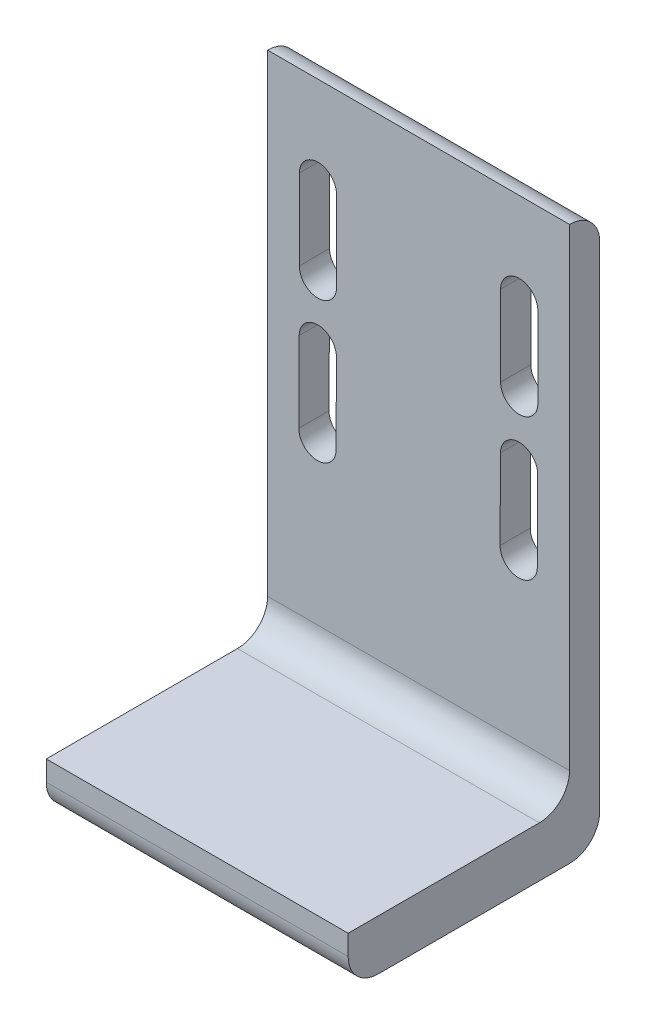
ISO-10303-21;
HEADER;
FILE_DESCRIPTION(('STEP AP214'),'2;1');
FILE_NAME('part.step','',(''),(''),'','','');
FILE_SCHEMA(('AUTOMOTIVE_DESIGN { 1 0 10303 214 1 1 1 1 }'));
ENDSEC;
DATA;
#1=APPLICATION_CONTEXT('core data for automotive mechanical design processes');
#2=APPLICATION_PROTOCOL_DEFINITION('international standard','automotive_design',2000,#1);
#3=PRODUCT_CONTEXT('',#1,'mechanical');
#4=PRODUCT('Part','Part','',(#3));
#5=PRODUCT_RELATED_PRODUCT_CATEGORY('part','',(#4));
#6=PRODUCT_DEFINITION_FORMATION('','',#4);
#7=PRODUCT_DEFINITION_CONTEXT('part definition',#1,'design');
#8=PRODUCT_DEFINITION('design','',#6,#7);
#9=PRODUCT_DEFINITION_SHAPE('','',#8);
#10=(LENGTH_UNIT() NAMED_UNIT(*) SI_UNIT(.MILLI.,.METRE.));
#11=(NAMED_UNIT(*) PLANE_ANGLE_UNIT() SI_UNIT($,.RADIAN.));
#12=(NAMED_UNIT(*) SI_UNIT($,.STERADIAN.) SOLID_ANGLE_UNIT());
#13=UNCERTAINTY_MEASURE_WITH_UNIT(LENGTH_MEASURE(1.E-05),#10,'distance_accuracy_value','');
#14=(GEOMETRIC_REPRESENTATION_CONTEXT(3) GLOBAL_UNCERTAINTY_ASSIGNED_CONTEXT((#13)) GLOBAL_UNIT_ASSIGNED_CONTEXT((#10,
#11,#12)) REPRESENTATION_CONTEXT('',''));
#15=CARTESIAN_POINT('',(0.,0.,0.));
#16=DIRECTION('',(0.,0.,1.));
#17=DIRECTION('',(1.,0.,0.));
#18=AXIS2_PLACEMENT_3D('',#15,#16,#17);
#19=CARTESIAN_POINT('',(0.,0.,3.));
#20=DIRECTION('',(0.,0.,-1.));
#21=DIRECTION('',(-1.,0.,0.));
#22=AXIS2_PLACEMENT_3D('',#19,#20,#21);
#23=PLANE('',#22);
#24=CARTESIAN_POINT('',(9.98523903623765,1.90319185863169,3.));
#25=DIRECTION('',(0.,0.,1.));
#26=DIRECTION('',(1.,0.,0.));
#27=AXIS2_PLACEMENT_3D('',#24,#25,#26);
#28=CIRCLE('',#27,1.85);
#29=CARTESIAN_POINT('',(11.8352173480357,1.89423385232464,3.));
#30=VERTEX_POINT('',#29);
#31=CARTESIAN_POINT('',(8.13526072443966,1.91214986493877,3.));
#32=VERTEX_POINT('',#31);
#33=EDGE_CURVE('E266',#30,#32,#28,.T.);
#34=ORIENTED_EDGE('',*,*,#33,.F.);
#35=DIRECTION('',(0.00484216557138159,0.999988276647571,0.));
#36=VECTOR('',#35,1.);
#37=CARTESIAN_POINT('',(11.8352173480357,1.89423385232464,3.));
#38=LINE('',#37,#36);
#39=CARTESIAN_POINT('',(11.7964800234646,-6.10567236085594,3.));
#40=VERTEX_POINT('',#39);
#41=EDGE_CURVE('E274',#40,#30,#38,.T.);
#42=ORIENTED_EDGE('',*,*,#41,.F.);
#43=CARTESIAN_POINT('',(9.9465017116666,-6.09671435454889,3.));
#44=DIRECTION('',(0.,0.,1.));
#45=DIRECTION('',(1.,0.,0.));
#46=AXIS2_PLACEMENT_3D('',#43,#44,#45);
#47=CIRCLE('',#46,1.85);
#48=CARTESIAN_POINT('',(8.09652339986859,-6.08775634824183,3.));
#49=VERTEX_POINT('',#48);
#50=EDGE_CURVE('E271',#49,#40,#47,.T.);
#51=ORIENTED_EDGE('',*,*,#50,.F.);
#52=DIRECTION('',(-0.00484216557138158,-0.999988276647571,0.));
#53=VECTOR('',#52,1.);
#54=CARTESIAN_POINT('',(8.13526072443966,1.91214986493877,3.));
#55=LINE('',#54,#53);
#56=EDGE_CURVE('E268',#32,#49,#55,.T.);
#57=ORIENTED_EDGE('',*,*,#56,.F.);
#58=EDGE_LOOP('',(#34,#42,#51,#57));
#59=FACE_BOUND('',#58,.T.);
#60=CARTESIAN_POINT('',(-10.0000000000004,8.00000000000205,3.));
#61=DIRECTION('',(0.,0.,1.));
#62=DIRECTION('',(1.,0.,0.));
#63=AXIS2_PLACEMENT_3D('',#60,#61,#62);
#64=CIRCLE('',#63,1.85);
#65=CARTESIAN_POINT('',(-11.8500000000004,8.00000000000205,3.));
#66=VERTEX_POINT('',#65);
#67=CARTESIAN_POINT('',(-8.15000000000039,8.00000000000204,3.));
#68=VERTEX_POINT('',#67);
#69=EDGE_CURVE('E328',#66,#68,#64,.T.);
#70=ORIENTED_EDGE('',*,*,#69,.F.);
#71=DIRECTION('',(0.,-1.,0.));
#72=VECTOR('',#71,1.);
#73=CARTESIAN_POINT('',(-11.8500000000004,8.00000000000205,3.));
#74=LINE('',#73,#72);
#75=CARTESIAN_POINT('',(-11.8500000000004,16.0000000000021,3.));
#76=VERTEX_POINT('',#75);
#77=EDGE_CURVE('E336',#76,#66,#74,.T.);
#78=ORIENTED_EDGE('',*,*,#77,.F.);
#79=CARTESIAN_POINT('',(-10.0000000000004,16.0000000000021,3.));
#80=DIRECTION('',(0.,0.,1.));
#81=DIRECTION('',(1.,0.,0.));
#82=AXIS2_PLACEMENT_3D('',#79,#80,#81);
#83=CIRCLE('',#82,1.85);
#84=CARTESIAN_POINT('',(-8.1500000000004,16.0000000000021,3.));
#85=VERTEX_POINT('',#84);
#86=EDGE_CURVE('E333',#85,#76,#83,.T.);
#87=ORIENTED_EDGE('',*,*,#86,.F.);
#88=DIRECTION('',(0.,1.,0.));
#89=VECTOR('',#88,1.);
#90=CARTESIAN_POINT('',(-8.15000000000039,8.00000000000204,3.));
#91=LINE('',#90,#89);
#92=EDGE_CURVE('E330',#68,#85,#91,.T.);
#93=ORIENTED_EDGE('',*,*,#92,.F.);
#94=EDGE_LOOP('',(#70,#78,#87,#93));
#95=FACE_BOUND('',#94,.T.);
#96=DIRECTION('',(0.,-1.,0.));
#97=VECTOR('',#96,1.);
#98=CARTESIAN_POINT('',(-15.,-25.,3.));
#99=LINE('',#98,#97);
#100=CARTESIAN_POINT('',(-15.,25.,3.));
#101=VERTEX_POINT('',#100);
#102=CARTESIAN_POINT('',(-15.,-22.,3.));
#103=VERTEX_POINT('',#102);
#104=EDGE_CURVE('E366',#101,#103,#99,.T.);
#105=ORIENTED_EDGE('',*,*,#104,.T.);
#106=DIRECTION('',(1.,0.,0.));
#107=VECTOR('',#106,1.);
#108=CARTESIAN_POINT('',(15.,-22.,3.));
#109=LINE('',#108,#107);
#110=CARTESIAN_POINT('',(15.,-22.,3.));
#111=VERTEX_POINT('',#110);
#112=EDGE_CURVE('E386',#103,#111,#109,.T.);
#113=ORIENTED_EDGE('',*,*,#112,.T.);
#114=DIRECTION('',(0.,1.,0.));
#115=VECTOR('',#114,1.);
#116=CARTESIAN_POINT('',(15.,-25.,3.));
#117=LINE('',#116,#115);
#118=CARTESIAN_POINT('',(15.,25.,3.));
#119=VERTEX_POINT('',#118);
#120=EDGE_CURVE('E359',#111,#119,#117,.T.);
#121=ORIENTED_EDGE('',*,*,#120,.T.);
#122=DIRECTION('',(-1.,0.,0.));
#123=VECTOR('',#122,1.);
#124=CARTESIAN_POINT('',(-15.,25.,3.));
#125=LINE('',#124,#123);
#126=EDGE_CURVE('E362',#119,#101,#125,.T.);
#127=ORIENTED_EDGE('',*,*,#126,.T.);
#128=EDGE_LOOP('',(#105,#113,#121,#127));
#129=FACE_BOUND('',#128,.T.);
#130=CARTESIAN_POINT('',(10.0000000000004,8.00000000000206,3.));
#131=DIRECTION('',(0.,0.,1.));
#132=DIRECTION('',(-1.,0.,0.));
#133=AXIS2_PLACEMENT_3D('',#130,#131,#132);
#134=CIRCLE('',#133,1.85);
#135=CARTESIAN_POINT('',(8.15000000000039,8.00000000000204,3.));
#136=VERTEX_POINT('',#135);
#137=CARTESIAN_POINT('',(11.8500000000004,8.00000000000205,3.));
#138=VERTEX_POINT('',#137);
#139=EDGE_CURVE('E297',#136,#138,#134,.T.);
#140=ORIENTED_EDGE('',*,*,#139,.F.);
#141=DIRECTION('',(0.,-1.,0.));
#142=VECTOR('',#141,1.);
#143=CARTESIAN_POINT('',(8.15000000000039,8.00000000000204,3.));
#144=LINE('',#143,#142);
#145=CARTESIAN_POINT('',(8.15000000000039,16.0000000000021,3.));
#146=VERTEX_POINT('',#145);
#147=EDGE_CURVE('E305',#146,#136,#144,.T.);
#148=ORIENTED_EDGE('',*,*,#147,.F.);
#149=CARTESIAN_POINT('',(10.0000000000004,16.0000000000021,3.));
#150=DIRECTION('',(0.,0.,1.));
#151=DIRECTION('',(-1.,0.,0.));
#152=AXIS2_PLACEMENT_3D('',#149,#150,#151);
#153=CIRCLE('',#152,1.85);
#154=CARTESIAN_POINT('',(11.8500000000004,16.0000000000021,3.));
#155=VERTEX_POINT('',#154);
#156=EDGE_CURVE('E302',#155,#146,#153,.T.);
#157=ORIENTED_EDGE('',*,*,#156,.F.);
#158=DIRECTION('',(0.,1.,0.));
#159=VECTOR('',#158,1.);
#160=CARTESIAN_POINT('',(11.8500000000004,8.00000000000205,3.));
#161=LINE('',#160,#159);
#162=EDGE_CURVE('E299',#138,#155,#161,.T.);
#163=ORIENTED_EDGE('',*,*,#162,.F.);
#164=EDGE_LOOP('',(#140,#148,#157,#163));
#165=FACE_BOUND('',#164,.T.);
#166=CARTESIAN_POINT('',(-10.0145264967145,2.00003517005933,3.));
#167=DIRECTION('',(0.,0.,1.));
#168=DIRECTION('',(-1.,0.,0.));
#169=AXIS2_PLACEMENT_3D('',#166,#167,#168);
#170=CIRCLE('',#169,1.85);
#171=CARTESIAN_POINT('',(-8.16454818491653,1.99107716375229,3.));
#172=VERTEX_POINT('',#171);
#173=CARTESIAN_POINT('',(-11.8645048085125,2.00899317636639,3.));
#174=VERTEX_POINT('',#173);
#175=EDGE_CURVE('E235',#172,#174,#170,.T.);
#176=ORIENTED_EDGE('',*,*,#175,.F.);
#177=DIRECTION('',(0.00484216557138158,0.999988276647571,0.));
#178=VECTOR('',#177,1.);
#179=CARTESIAN_POINT('',(-8.16454818491653,1.99107716375229,3.));
#180=LINE('',#179,#178);
#181=CARTESIAN_POINT('',(-8.20328550948758,-6.00882904942831,3.));
#182=VERTEX_POINT('',#181);
#183=EDGE_CURVE('E243',#182,#172,#180,.T.);
#184=ORIENTED_EDGE('',*,*,#183,.F.);
#185=CARTESIAN_POINT('',(-10.0532638212856,-5.99987104312124,3.));
#186=DIRECTION('',(0.,0.,1.));
#187=DIRECTION('',(-1.,0.,0.));
#188=AXIS2_PLACEMENT_3D('',#185,#186,#187);
#189=CIRCLE('',#188,1.85);
#190=CARTESIAN_POINT('',(-11.9032421330836,-5.99091303681418,3.));
#191=VERTEX_POINT('',#190);
#192=EDGE_CURVE('E240',#191,#182,#189,.T.);
#193=ORIENTED_EDGE('',*,*,#192,.F.);
#194=DIRECTION('',(-0.00484216557138139,-0.999988276647571,0.));
#195=VECTOR('',#194,1.);
#196=CARTESIAN_POINT('',(-11.8645048085125,2.00899317636639,3.));
#197=LINE('',#196,#195);
#198=EDGE_CURVE('E237',#174,#191,#197,.T.);
#199=ORIENTED_EDGE('',*,*,#198,.F.);
#200=EDGE_LOOP('',(#176,#184,#193,#199));
#201=FACE_BOUND('',#200,.T.);
#202=ADVANCED_FACE('F35',(#59,#95,#129,#165,#201),#23,.F.);
#203=CARTESIAN_POINT('',(0.,0.,0.));
#204=DIRECTION('',(0.,0.,-1.));
#205=DIRECTION('',(-1.,0.,0.));
#206=AXIS2_PLACEMENT_3D('',#203,#204,#205);
#207=PLANE('',#206);
#208=DIRECTION('',(0.,-1.,0.));
#209=VECTOR('',#208,1.);
#210=CARTESIAN_POINT('',(-15.,-25.,0.));
#211=LINE('',#210,#209);
#212=CARTESIAN_POINT('',(-15.,22.,0.));
#213=VERTEX_POINT('',#212);
#214=CARTESIAN_POINT('',(-15.,-27.,0.));
#215=VERTEX_POINT('',#214);
#216=EDGE_CURVE('E363',#213,#215,#211,.T.);
#217=ORIENTED_EDGE('',*,*,#216,.F.);
#218=DIRECTION('',(-1.,0.,0.));
#219=VECTOR('',#218,1.);
#220=CARTESIAN_POINT('',(15.,22.,0.));
#221=LINE('',#220,#219);
#222=CARTESIAN_POINT('',(15.,22.,0.));
#223=VERTEX_POINT('',#222);
#224=EDGE_CURVE('E380',#213,#223,#221,.F.);
#225=ORIENTED_EDGE('',*,*,#224,.T.);
#226=DIRECTION('',(0.,1.,0.));
#227=VECTOR('',#226,1.);
#228=CARTESIAN_POINT('',(15.,-25.,0.));
#229=LINE('',#228,#227);
#230=CARTESIAN_POINT('',(15.,-27.,0.));
#231=VERTEX_POINT('',#230);
#232=EDGE_CURVE('E358',#231,#223,#229,.T.);
#233=ORIENTED_EDGE('',*,*,#232,.F.);
#234=DIRECTION('',(1.,0.,0.));
#235=VECTOR('',#234,1.);
#236=CARTESIAN_POINT('',(-15.,-27.,0.));
#237=LINE('',#236,#235);
#238=EDGE_CURVE('E378',#231,#215,#237,.F.);
#239=ORIENTED_EDGE('',*,*,#238,.T.);
#240=EDGE_LOOP('',(#217,#225,#233,#239));
#241=FACE_BOUND('',#240,.T.);
#242=DIRECTION('',(0.,-1.,0.));
#243=VECTOR('',#242,1.);
#244=CARTESIAN_POINT('',(-11.8500000000004,8.00000000000205,0.));
#245=LINE('',#244,#243);
#246=CARTESIAN_POINT('',(-11.8500000000004,16.0000000000021,0.));
#247=VERTEX_POINT('',#246);
#248=CARTESIAN_POINT('',(-11.8500000000004,8.00000000000205,0.));
#249=VERTEX_POINT('',#248);
#250=EDGE_CURVE('E331',#247,#249,#245,.T.);
#251=ORIENTED_EDGE('',*,*,#250,.T.);
#252=CARTESIAN_POINT('',(-10.0000000000004,8.00000000000205,0.));
#253=DIRECTION('',(0.,0.,1.));
#254=DIRECTION('',(1.,0.,0.));
#255=AXIS2_PLACEMENT_3D('',#252,#253,#254);
#256=CIRCLE('',#255,1.85);
#257=CARTESIAN_POINT('',(-8.15000000000039,8.00000000000204,0.));
#258=VERTEX_POINT('',#257);
#259=EDGE_CURVE('E327',#249,#258,#256,.T.);
#260=ORIENTED_EDGE('',*,*,#259,.T.);
#261=DIRECTION('',(0.,1.,0.));
#262=VECTOR('',#261,1.);
#263=CARTESIAN_POINT('',(-8.15000000000039,8.00000000000204,0.));
#264=LINE('',#263,#262);
#265=CARTESIAN_POINT('',(-8.1500000000004,16.0000000000021,0.));
#266=VERTEX_POINT('',#265);
#267=EDGE_CURVE('E341',#258,#266,#264,.T.);
#268=ORIENTED_EDGE('',*,*,#267,.T.);
#269=CARTESIAN_POINT('',(-10.0000000000004,16.0000000000021,0.));
#270=DIRECTION('',(0.,0.,1.));
#271=DIRECTION('',(1.,0.,0.));
#272=AXIS2_PLACEMENT_3D('',#269,#270,#271);
#273=CIRCLE('',#272,1.85);
#274=EDGE_CURVE('E344',#266,#247,#273,.T.);
#275=ORIENTED_EDGE('',*,*,#274,.T.);
#276=EDGE_LOOP('',(#251,#260,#268,#275));
#277=FACE_BOUND('',#276,.T.);
#278=DIRECTION('',(0.,-1.,0.));
#279=VECTOR('',#278,1.);
#280=CARTESIAN_POINT('',(8.15000000000039,8.00000000000204,0.));
#281=LINE('',#280,#279);
#282=CARTESIAN_POINT('',(8.15000000000037,16.0000000000021,0.));
#283=VERTEX_POINT('',#282);
#284=CARTESIAN_POINT('',(8.15000000000039,8.00000000000204,0.));
#285=VERTEX_POINT('',#284);
#286=EDGE_CURVE('E300',#283,#285,#281,.T.);
#287=ORIENTED_EDGE('',*,*,#286,.T.);
#288=CARTESIAN_POINT('',(10.0000000000004,8.00000000000206,0.));
#289=DIRECTION('',(0.,0.,1.));
#290=DIRECTION('',(-1.,0.,0.));
#291=AXIS2_PLACEMENT_3D('',#288,#289,#290);
#292=CIRCLE('',#291,1.85);
#293=CARTESIAN_POINT('',(11.8500000000004,8.00000000000205,0.));
#294=VERTEX_POINT('',#293);
#295=EDGE_CURVE('E296',#285,#294,#292,.T.);
#296=ORIENTED_EDGE('',*,*,#295,.T.);
#297=DIRECTION('',(0.,1.,0.));
#298=VECTOR('',#297,1.);
#299=CARTESIAN_POINT('',(11.8500000000004,8.00000000000205,0.));
#300=LINE('',#299,#298);
#301=CARTESIAN_POINT('',(11.8500000000004,16.0000000000021,0.));
#302=VERTEX_POINT('',#301);
#303=EDGE_CURVE('E310',#294,#302,#300,.T.);
#304=ORIENTED_EDGE('',*,*,#303,.T.);
#305=CARTESIAN_POINT('',(10.0000000000004,16.0000000000021,0.));
#306=DIRECTION('',(0.,0.,1.));
#307=DIRECTION('',(-1.,0.,0.));
#308=AXIS2_PLACEMENT_3D('',#305,#306,#307);
#309=CIRCLE('',#308,1.85);
#310=EDGE_CURVE('E313',#302,#283,#309,.T.);
#311=ORIENTED_EDGE('',*,*,#310,.T.);
#312=EDGE_LOOP('',(#287,#296,#304,#311));
#313=FACE_BOUND('',#312,.T.);
#314=DIRECTION('',(0.00484216557138159,0.999988276647571,0.));
#315=VECTOR('',#314,1.);
#316=CARTESIAN_POINT('',(11.8352173480357,1.89423385232464,0.));
#317=LINE('',#316,#315);
#318=CARTESIAN_POINT('',(11.7964800234646,-6.10567236085594,0.));
#319=VERTEX_POINT('',#318);
#320=CARTESIAN_POINT('',(11.8352173480357,1.89423385232464,0.));
#321=VERTEX_POINT('',#320);
#322=EDGE_CURVE('E269',#319,#321,#317,.T.);
#323=ORIENTED_EDGE('',*,*,#322,.T.);
#324=CARTESIAN_POINT('',(9.98523903623765,1.90319185863169,0.));
#325=DIRECTION('',(0.,0.,1.));
#326=DIRECTION('',(1.,0.,0.));
#327=AXIS2_PLACEMENT_3D('',#324,#325,#326);
#328=CIRCLE('',#327,1.85);
#329=CARTESIAN_POINT('',(8.13526072443966,1.91214986493877,0.));
#330=VERTEX_POINT('',#329);
#331=EDGE_CURVE('E265',#321,#330,#328,.T.);
#332=ORIENTED_EDGE('',*,*,#331,.T.);
#333=DIRECTION('',(-0.00484216557138158,-0.999988276647571,0.));
#334=VECTOR('',#333,1.);
#335=CARTESIAN_POINT('',(8.13526072443966,1.91214986493877,0.));
#336=LINE('',#335,#334);
#337=CARTESIAN_POINT('',(8.09652339986859,-6.08775634824183,0.));
#338=VERTEX_POINT('',#337);
#339=EDGE_CURVE('E279',#330,#338,#336,.T.);
#340=ORIENTED_EDGE('',*,*,#339,.T.);
#341=CARTESIAN_POINT('',(9.9465017116666,-6.09671435454889,0.));
#342=DIRECTION('',(0.,0.,1.));
#343=DIRECTION('',(1.,0.,0.));
#344=AXIS2_PLACEMENT_3D('',#341,#342,#343);
#345=CIRCLE('',#344,1.85);
#346=EDGE_CURVE('E282',#338,#319,#345,.T.);
#347=ORIENTED_EDGE('',*,*,#346,.T.);
#348=EDGE_LOOP('',(#323,#332,#340,#347));
#349=FACE_BOUND('',#348,.T.);
#350=DIRECTION('',(0.00484216557138158,0.999988276647571,0.));
#351=VECTOR('',#350,1.);
#352=CARTESIAN_POINT('',(-8.16454818491653,1.99107716375229,0.));
#353=LINE('',#352,#351);
#354=CARTESIAN_POINT('',(-8.20328550948759,-6.00882904942832,0.));
#355=VERTEX_POINT('',#354);
#356=CARTESIAN_POINT('',(-8.16454818491653,1.99107716375229,0.));
#357=VERTEX_POINT('',#356);
#358=EDGE_CURVE('E238',#355,#357,#353,.T.);
#359=ORIENTED_EDGE('',*,*,#358,.T.);
#360=CARTESIAN_POINT('',(-10.0145264967145,2.00003517005933,0.));
#361=DIRECTION('',(0.,0.,1.));
#362=DIRECTION('',(-1.,0.,0.));
#363=AXIS2_PLACEMENT_3D('',#360,#361,#362);
#364=CIRCLE('',#363,1.85);
#365=CARTESIAN_POINT('',(-11.8645048085125,2.00899317636639,0.));
#366=VERTEX_POINT('',#365);
#367=EDGE_CURVE('E234',#357,#366,#364,.T.);
#368=ORIENTED_EDGE('',*,*,#367,.T.);
#369=DIRECTION('',(-0.00484216557138139,-0.999988276647571,0.));
#370=VECTOR('',#369,1.);
#371=CARTESIAN_POINT('',(-11.8645048085125,2.00899317636639,0.));
#372=LINE('',#371,#370);
#373=CARTESIAN_POINT('',(-11.9032421330836,-5.99091303681418,0.));
#374=VERTEX_POINT('',#373);
#375=EDGE_CURVE('E248',#366,#374,#372,.T.);
#376=ORIENTED_EDGE('',*,*,#375,.T.);
#377=CARTESIAN_POINT('',(-10.0532638212856,-5.99987104312124,0.));
#378=DIRECTION('',(0.,0.,1.));
#379=DIRECTION('',(-1.,0.,0.));
#380=AXIS2_PLACEMENT_3D('',#377,#378,#379);
#381=CIRCLE('',#380,1.85);
#382=EDGE_CURVE('E251',#374,#355,#381,.T.);
#383=ORIENTED_EDGE('',*,*,#382,.T.);
#384=EDGE_LOOP('',(#359,#368,#376,#383));
#385=FACE_BOUND('',#384,.T.);
#386=ADVANCED_FACE('F416',(#241,#277,#313,#349,#385),#207,.T.);
#387=CARTESIAN_POINT('',(15.,-25.,3.));
#388=DIRECTION('',(-1.,0.,0.));
#389=DIRECTION('',(0.,0.,1.));
#390=AXIS2_PLACEMENT_3D('',#387,#388,#389);
#391=PLANE('',#390);
#392=ORIENTED_EDGE('',*,*,#232,.T.);
#393=CARTESIAN_POINT('',(15.,22.,3.));
#394=DIRECTION('',(-1.,0.,0.));
#395=DIRECTION('',(0.,0.,1.));
#396=AXIS2_PLACEMENT_3D('',#393,#394,#395);
#397=CIRCLE('',#396,3.);
#398=EDGE_CURVE('E384',#223,#119,#397,.F.);
#399=ORIENTED_EDGE('',*,*,#398,.T.);
#400=ORIENTED_EDGE('',*,*,#120,.F.);
#401=CARTESIAN_POINT('',(15.,-22.,6.));
#402=DIRECTION('',(-1.,0.,0.));
#403=DIRECTION('',(0.,0.,1.));
#404=AXIS2_PLACEMENT_3D('',#401,#402,#403);
#405=CIRCLE('',#404,3.);
#406=CARTESIAN_POINT('',(15.,-25.,6.));
#407=VERTEX_POINT('',#406);
#408=EDGE_CURVE('E43',#111,#407,#405,.T.);
#409=ORIENTED_EDGE('',*,*,#408,.T.);
#410=DIRECTION('',(0.,0.,-1.));
#411=VECTOR('',#410,1.);
#412=CARTESIAN_POINT('',(15.,-25.,25.));
#413=LINE('',#412,#411);
#414=CARTESIAN_POINT('',(15.,-25.,25.));
#415=VERTEX_POINT('',#414);
#416=EDGE_CURVE('E214',#415,#407,#413,.T.);
#417=ORIENTED_EDGE('',*,*,#416,.F.);
#418=DIRECTION('',(0.,1.,0.));
#419=VECTOR('',#418,1.);
#420=CARTESIAN_POINT('',(15.,-25.,25.));
#421=LINE('',#420,#419);
#422=CARTESIAN_POINT('',(15.,-27.,25.));
#423=VERTEX_POINT('',#422);
#424=EDGE_CURVE('E202',#423,#415,#421,.T.);
#425=ORIENTED_EDGE('',*,*,#424,.F.);
#426=CARTESIAN_POINT('',(15.,-27.,22.));
#427=DIRECTION('',(-1.,0.,0.));
#428=DIRECTION('',(0.,0.,1.));
#429=AXIS2_PLACEMENT_3D('',#426,#427,#428);
#430=CIRCLE('',#429,3.);
#431=CARTESIAN_POINT('',(15.,-30.,22.));
#432=VERTEX_POINT('',#431);
#433=EDGE_CURVE('E58',#423,#432,#430,.F.);
#434=ORIENTED_EDGE('',*,*,#433,.T.);
#435=DIRECTION('',(0.,0.,-1.));
#436=VECTOR('',#435,1.);
#437=CARTESIAN_POINT('',(15.,-30.,25.));
#438=LINE('',#437,#436);
#439=CARTESIAN_POINT('',(15.,-30.,3.));
#440=VERTEX_POINT('',#439);
#441=EDGE_CURVE('E220',#432,#440,#438,.T.);
#442=ORIENTED_EDGE('',*,*,#441,.T.);
#443=CARTESIAN_POINT('',(15.,-27.,3.));
#444=DIRECTION('',(-1.,0.,0.));
#445=DIRECTION('',(0.,0.,1.));
#446=AXIS2_PLACEMENT_3D('',#443,#444,#445);
#447=CIRCLE('',#446,3.);
#448=EDGE_CURVE('E50',#440,#231,#447,.F.);
#449=ORIENTED_EDGE('',*,*,#448,.T.);
#450=EDGE_LOOP('',(#392,#399,#400,#409,#417,#425,#434,#442,#449));
#451=FACE_BOUND('',#450,.T.);
#452=ADVANCED_FACE('F216',(#451),#391,.F.);
#453=CARTESIAN_POINT('',(-15.,-25.,3.));
#454=DIRECTION('',(1.,0.,0.));
#455=DIRECTION('',(0.,0.,-1.));
#456=AXIS2_PLACEMENT_3D('',#453,#454,#455);
#457=PLANE('',#456);
#458=ORIENTED_EDGE('',*,*,#104,.F.);
#459=CARTESIAN_POINT('',(-15.,22.,3.));
#460=DIRECTION('',(1.,0.,0.));
#461=DIRECTION('',(0.,0.,-1.));
#462=AXIS2_PLACEMENT_3D('',#459,#460,#461);
#463=CIRCLE('',#462,3.);
#464=EDGE_CURVE('E376',#101,#213,#463,.F.);
#465=ORIENTED_EDGE('',*,*,#464,.T.);
#466=ORIENTED_EDGE('',*,*,#216,.T.);
#467=CARTESIAN_POINT('',(-15.,-27.,3.));
#468=DIRECTION('',(1.,0.,0.));
#469=DIRECTION('',(0.,0.,-1.));
#470=AXIS2_PLACEMENT_3D('',#467,#468,#469);
#471=CIRCLE('',#470,3.);
#472=CARTESIAN_POINT('',(-15.,-30.,3.));
#473=VERTEX_POINT('',#472);
#474=EDGE_CURVE('E369',#215,#473,#471,.F.);
#475=ORIENTED_EDGE('',*,*,#474,.T.);
#476=DIRECTION('',(0.,0.,-1.));
#477=VECTOR('',#476,1.);
#478=CARTESIAN_POINT('',(-15.,-30.,25.));
#479=LINE('',#478,#477);
#480=CARTESIAN_POINT('',(-15.,-30.,22.));
#481=VERTEX_POINT('',#480);
#482=EDGE_CURVE('E231',#481,#473,#479,.T.);
#483=ORIENTED_EDGE('',*,*,#482,.F.);
#484=CARTESIAN_POINT('',(-15.,-27.,22.));
#485=DIRECTION('',(1.,0.,0.));
#486=DIRECTION('',(0.,0.,-1.));
#487=AXIS2_PLACEMENT_3D('',#484,#485,#486);
#488=CIRCLE('',#487,3.);
#489=CARTESIAN_POINT('',(-15.,-27.,25.));
#490=VERTEX_POINT('',#489);
#491=EDGE_CURVE('E374',#481,#490,#488,.F.);
#492=ORIENTED_EDGE('',*,*,#491,.T.);
#493=DIRECTION('',(0.,-1.,0.));
#494=VECTOR('',#493,1.);
#495=CARTESIAN_POINT('',(-15.,-25.,25.));
#496=LINE('',#495,#494);
#497=CARTESIAN_POINT('',(-15.,-25.,25.));
#498=VERTEX_POINT('',#497);
#499=EDGE_CURVE('E211',#498,#490,#496,.T.);
#500=ORIENTED_EDGE('',*,*,#499,.F.);
#501=DIRECTION('',(0.,0.,-1.));
#502=VECTOR('',#501,1.);
#503=CARTESIAN_POINT('',(-15.,-25.,25.));
#504=LINE('',#503,#502);
#505=CARTESIAN_POINT('',(-15.,-25.,6.));
#506=VERTEX_POINT('',#505);
#507=EDGE_CURVE('E221',#498,#506,#504,.T.);
#508=ORIENTED_EDGE('',*,*,#507,.T.);
#509=CARTESIAN_POINT('',(-15.,-22.,6.));
#510=DIRECTION('',(1.,0.,0.));
#511=DIRECTION('',(0.,0.,-1.));
#512=AXIS2_PLACEMENT_3D('',#509,#510,#511);
#513=CIRCLE('',#512,3.);
#514=EDGE_CURVE('E12',#506,#103,#513,.T.);
#515=ORIENTED_EDGE('',*,*,#514,.T.);
#516=EDGE_LOOP('',(#458,#465,#466,#475,#483,#492,#500,#508,#515));
#517=FACE_BOUND('',#516,.T.);
#518=ADVANCED_FACE('F403',(#517),#457,.F.);
#519=CARTESIAN_POINT('',(-10.0000000000004,8.00000000000205,3.));
#520=DIRECTION('',(0.,0.,-1.));
#521=DIRECTION('',(-1.,0.,0.));
#522=AXIS2_PLACEMENT_3D('',#519,#520,#521);
#523=CYLINDRICAL_SURFACE('',#522,1.85);
#524=ORIENTED_EDGE('',*,*,#259,.F.);
#525=DIRECTION('',(0.,0.,-1.));
#526=VECTOR('',#525,1.);
#527=CARTESIAN_POINT('',(-11.8500000000004,8.00000000000205,3.));
#528=LINE('',#527,#526);
#529=EDGE_CURVE('E338',#66,#249,#528,.T.);
#530=ORIENTED_EDGE('',*,*,#529,.F.);
#531=ORIENTED_EDGE('',*,*,#69,.T.);
#532=DIRECTION('',(0.,0.,-1.));
#533=VECTOR('',#532,1.);
#534=CARTESIAN_POINT('',(-8.15000000000039,8.00000000000204,3.));
#535=LINE('',#534,#533);
#536=EDGE_CURVE('E355',#68,#258,#535,.T.);
#537=ORIENTED_EDGE('',*,*,#536,.T.);
#538=EDGE_LOOP('',(#524,#530,#531,#537));
#539=FACE_BOUND('',#538,.T.);
#540=ADVANCED_FACE('F427',(#539),#523,.F.);
#541=CARTESIAN_POINT('',(-8.15000000000039,8.00000000000204,3.));
#542=DIRECTION('',(-1.,0.,0.));
#543=DIRECTION('',(0.,-1.,0.));
#544=AXIS2_PLACEMENT_3D('',#541,#542,#543);
#545=PLANE('',#544);
#546=ORIENTED_EDGE('',*,*,#267,.F.);
#547=ORIENTED_EDGE('',*,*,#536,.F.);
#548=ORIENTED_EDGE('',*,*,#92,.T.);
#549=DIRECTION('',(0.,0.,-1.));
#550=VECTOR('',#549,1.);
#551=CARTESIAN_POINT('',(-8.1500000000004,16.0000000000021,3.));
#552=LINE('',#551,#550);
#553=EDGE_CURVE('E353',#85,#266,#552,.T.);
#554=ORIENTED_EDGE('',*,*,#553,.T.);
#555=EDGE_LOOP('',(#546,#547,#548,#554));
#556=FACE_BOUND('',#555,.T.);
#557=ADVANCED_FACE('F524',(#556),#545,.T.);
#558=CARTESIAN_POINT('',(-10.0000000000004,16.0000000000021,3.));
#559=DIRECTION('',(0.,0.,-1.));
#560=DIRECTION('',(-1.,0.,0.));
#561=AXIS2_PLACEMENT_3D('',#558,#559,#560);
#562=CYLINDRICAL_SURFACE('',#561,1.85);
#563=ORIENTED_EDGE('',*,*,#274,.F.);
#564=ORIENTED_EDGE('',*,*,#553,.F.);
#565=ORIENTED_EDGE('',*,*,#86,.T.);
#566=DIRECTION('',(0.,0.,-1.));
#567=VECTOR('',#566,1.);
#568=CARTESIAN_POINT('',(-11.8500000000004,16.0000000000021,3.));
#569=LINE('',#568,#567);
#570=EDGE_CURVE('E351',#76,#247,#569,.T.);
#571=ORIENTED_EDGE('',*,*,#570,.T.);
#572=EDGE_LOOP('',(#563,#564,#565,#571));
#573=FACE_BOUND('',#572,.T.);
#574=ADVANCED_FACE('F521',(#573),#562,.F.);
#575=CARTESIAN_POINT('',(-11.8500000000004,8.00000000000205,3.));
#576=DIRECTION('',(1.,0.,0.));
#577=DIRECTION('',(0.,1.,0.));
#578=AXIS2_PLACEMENT_3D('',#575,#576,#577);
#579=PLANE('',#578);
#580=ORIENTED_EDGE('',*,*,#250,.F.);
#581=ORIENTED_EDGE('',*,*,#570,.F.);
#582=ORIENTED_EDGE('',*,*,#77,.T.);
#583=ORIENTED_EDGE('',*,*,#529,.T.);
#584=EDGE_LOOP('',(#580,#581,#582,#583));
#585=FACE_BOUND('',#584,.T.);
#586=ADVANCED_FACE('F517',(#585),#579,.T.);
#587=CARTESIAN_POINT('',(10.0000000000004,8.00000000000206,3.));
#588=DIRECTION('',(0.,0.,-1.));
#589=DIRECTION('',(-1.,0.,0.));
#590=AXIS2_PLACEMENT_3D('',#587,#588,#589);
#591=CYLINDRICAL_SURFACE('',#590,1.85);
#592=ORIENTED_EDGE('',*,*,#295,.F.);
#593=DIRECTION('',(0.,0.,-1.));
#594=VECTOR('',#593,1.);
#595=CARTESIAN_POINT('',(8.15000000000039,8.00000000000204,3.));
#596=LINE('',#595,#594);
#597=EDGE_CURVE('E307',#136,#285,#596,.T.);
#598=ORIENTED_EDGE('',*,*,#597,.F.);
#599=ORIENTED_EDGE('',*,*,#139,.T.);
#600=DIRECTION('',(0.,0.,-1.));
#601=VECTOR('',#600,1.);
#602=CARTESIAN_POINT('',(11.8500000000004,8.00000000000205,3.));
#603=LINE('',#602,#601);
#604=EDGE_CURVE('E324',#138,#294,#603,.T.);
#605=ORIENTED_EDGE('',*,*,#604,.T.);
#606=EDGE_LOOP('',(#592,#598,#599,#605));
#607=FACE_BOUND('',#606,.T.);
#608=ADVANCED_FACE('F513',(#607),#591,.F.);
#609=CARTESIAN_POINT('',(11.8500000000004,8.00000000000205,3.));
#610=DIRECTION('',(-1.,0.,0.));
#611=DIRECTION('',(0.,-1.,0.));
#612=AXIS2_PLACEMENT_3D('',#609,#610,#611);
#613=PLANE('',#612);
#614=ORIENTED_EDGE('',*,*,#303,.F.);
#615=ORIENTED_EDGE('',*,*,#604,.F.);
#616=ORIENTED_EDGE('',*,*,#162,.T.);
#617=DIRECTION('',(0.,0.,-1.));
#618=VECTOR('',#617,1.);
#619=CARTESIAN_POINT('',(11.8500000000004,16.0000000000021,3.));
#620=LINE('',#619,#618);
#621=EDGE_CURVE('E322',#155,#302,#620,.T.);
#622=ORIENTED_EDGE('',*,*,#621,.T.);
#623=EDGE_LOOP('',(#614,#615,#616,#622));
#624=FACE_BOUND('',#623,.T.);
#625=ADVANCED_FACE('F509',(#624),#613,.T.);
#626=CARTESIAN_POINT('',(10.0000000000004,16.0000000000021,3.));
#627=DIRECTION('',(0.,0.,-1.));
#628=DIRECTION('',(-1.,0.,0.));
#629=AXIS2_PLACEMENT_3D('',#626,#627,#628);
#630=CYLINDRICAL_SURFACE('',#629,1.85);
#631=ORIENTED_EDGE('',*,*,#310,.F.);
#632=ORIENTED_EDGE('',*,*,#621,.F.);
#633=ORIENTED_EDGE('',*,*,#156,.T.);
#634=DIRECTION('',(0.,0.,-1.));
#635=VECTOR('',#634,1.);
#636=CARTESIAN_POINT('',(8.15000000000037,16.0000000000021,3.));
#637=LINE('',#636,#635);
#638=EDGE_CURVE('E320',#146,#283,#637,.T.);
#639=ORIENTED_EDGE('',*,*,#638,.T.);
#640=EDGE_LOOP('',(#631,#632,#633,#639));
#641=FACE_BOUND('',#640,.T.);
#642=ADVANCED_FACE('F505',(#641),#630,.F.);
#643=CARTESIAN_POINT('',(8.15000000000039,8.00000000000204,3.));
#644=DIRECTION('',(1.,0.,0.));
#645=DIRECTION('',(0.,1.,0.));
#646=AXIS2_PLACEMENT_3D('',#643,#644,#645);
#647=PLANE('',#646);
#648=ORIENTED_EDGE('',*,*,#286,.F.);
#649=ORIENTED_EDGE('',*,*,#638,.F.);
#650=ORIENTED_EDGE('',*,*,#147,.T.);
#651=ORIENTED_EDGE('',*,*,#597,.T.);
#652=EDGE_LOOP('',(#648,#649,#650,#651));
#653=FACE_BOUND('',#652,.T.);
#654=ADVANCED_FACE('F501',(#653),#647,.T.);
#655=CARTESIAN_POINT('',(9.98523903623765,1.90319185863169,3.));
#656=DIRECTION('',(0.,0.,-1.));
#657=DIRECTION('',(-1.,0.,0.));
#658=AXIS2_PLACEMENT_3D('',#655,#656,#657);
#659=CYLINDRICAL_SURFACE('',#658,1.85);
#660=ORIENTED_EDGE('',*,*,#331,.F.);
#661=DIRECTION('',(0.,0.,-1.));
#662=VECTOR('',#661,1.);
#663=CARTESIAN_POINT('',(11.8352173480357,1.89423385232464,3.));
#664=LINE('',#663,#662);
#665=EDGE_CURVE('E276',#30,#321,#664,.T.);
#666=ORIENTED_EDGE('',*,*,#665,.F.);
#667=ORIENTED_EDGE('',*,*,#33,.T.);
#668=DIRECTION('',(0.,0.,-1.));
#669=VECTOR('',#668,1.);
#670=CARTESIAN_POINT('',(8.13526072443966,1.91214986493877,3.));
#671=LINE('',#670,#669);
#672=EDGE_CURVE('E293',#32,#330,#671,.T.);
#673=ORIENTED_EDGE('',*,*,#672,.T.);
#674=EDGE_LOOP('',(#660,#666,#667,#673));
#675=FACE_BOUND('',#674,.T.);
#676=ADVANCED_FACE('F497',(#675),#659,.F.);
#677=CARTESIAN_POINT('',(8.13526072443966,1.91214986493877,3.));
#678=DIRECTION('',(0.999988276647571,-0.00484216557138159,0.));
#679=DIRECTION('',(0.00484216557138159,0.999988276647571,0.));
#680=AXIS2_PLACEMENT_3D('',#677,#678,#679);
#681=PLANE('',#680);
#682=ORIENTED_EDGE('',*,*,#339,.F.);
#683=ORIENTED_EDGE('',*,*,#672,.F.);
#684=ORIENTED_EDGE('',*,*,#56,.T.);
#685=DIRECTION('',(0.,0.,-1.));
#686=VECTOR('',#685,1.);
#687=CARTESIAN_POINT('',(8.09652339986859,-6.08775634824183,3.));
#688=LINE('',#687,#686);
#689=EDGE_CURVE('E291',#49,#338,#688,.T.);
#690=ORIENTED_EDGE('',*,*,#689,.T.);
#691=EDGE_LOOP('',(#682,#683,#684,#690));
#692=FACE_BOUND('',#691,.T.);
#693=ADVANCED_FACE('F493',(#692),#681,.T.);
#694=CARTESIAN_POINT('',(9.9465017116666,-6.09671435454889,3.));
#695=DIRECTION('',(0.,0.,-1.));
#696=DIRECTION('',(-1.,0.,0.));
#697=AXIS2_PLACEMENT_3D('',#694,#695,#696);
#698=CYLINDRICAL_SURFACE('',#697,1.85);
#699=ORIENTED_EDGE('',*,*,#346,.F.);
#700=ORIENTED_EDGE('',*,*,#689,.F.);
#701=ORIENTED_EDGE('',*,*,#50,.T.);
#702=DIRECTION('',(0.,0.,-1.));
#703=VECTOR('',#702,1.);
#704=CARTESIAN_POINT('',(11.7964800234646,-6.10567236085594,3.));
#705=LINE('',#704,#703);
#706=EDGE_CURVE('E289',#40,#319,#705,.T.);
#707=ORIENTED_EDGE('',*,*,#706,.T.);
#708=EDGE_LOOP('',(#699,#700,#701,#707));
#709=FACE_BOUND('',#708,.T.);
#710=ADVANCED_FACE('F489',(#709),#698,.F.);
#711=CARTESIAN_POINT('',(11.8352173480357,1.89423385232464,3.));
#712=DIRECTION('',(-0.999988276647571,0.00484216557138159,0.));
#713=DIRECTION('',(-0.00484216557138159,-0.999988276647571,0.));
#714=AXIS2_PLACEMENT_3D('',#711,#712,#713);
#715=PLANE('',#714);
#716=ORIENTED_EDGE('',*,*,#322,.F.);
#717=ORIENTED_EDGE('',*,*,#706,.F.);
#718=ORIENTED_EDGE('',*,*,#41,.T.);
#719=ORIENTED_EDGE('',*,*,#665,.T.);
#720=EDGE_LOOP('',(#716,#717,#718,#719));
#721=FACE_BOUND('',#720,.T.);
#722=ADVANCED_FACE('F486',(#721),#715,.T.);
#723=CARTESIAN_POINT('',(-10.0145264967145,2.00003517005933,3.));
#724=DIRECTION('',(0.,0.,-1.));
#725=DIRECTION('',(-1.,0.,0.));
#726=AXIS2_PLACEMENT_3D('',#723,#724,#725);
#727=CYLINDRICAL_SURFACE('',#726,1.85);
#728=ORIENTED_EDGE('',*,*,#367,.F.);
#729=DIRECTION('',(0.,0.,-1.));
#730=VECTOR('',#729,1.);
#731=CARTESIAN_POINT('',(-8.16454818491653,1.99107716375229,3.));
#732=LINE('',#731,#730);
#733=EDGE_CURVE('E245',#172,#357,#732,.T.);
#734=ORIENTED_EDGE('',*,*,#733,.F.);
#735=ORIENTED_EDGE('',*,*,#175,.T.);
#736=DIRECTION('',(0.,0.,-1.));
#737=VECTOR('',#736,1.);
#738=CARTESIAN_POINT('',(-11.8645048085125,2.00899317636639,3.));
#739=LINE('',#738,#737);
#740=EDGE_CURVE('E262',#174,#366,#739,.T.);
#741=ORIENTED_EDGE('',*,*,#740,.T.);
#742=EDGE_LOOP('',(#728,#734,#735,#741));
#743=FACE_BOUND('',#742,.T.);
#744=ADVANCED_FACE('F464',(#743),#727,.F.);
#745=CARTESIAN_POINT('',(-11.8645048085125,2.00899317636639,3.));
#746=DIRECTION('',(0.999988276647571,-0.00484216557138139,0.));
#747=DIRECTION('',(0.00484216557138139,0.999988276647571,0.));
#748=AXIS2_PLACEMENT_3D('',#745,#746,#747);
#749=PLANE('',#748);
#750=ORIENTED_EDGE('',*,*,#375,.F.);
#751=ORIENTED_EDGE('',*,*,#740,.F.);
#752=ORIENTED_EDGE('',*,*,#198,.T.);
#753=DIRECTION('',(0.,0.,-1.));
#754=VECTOR('',#753,1.);
#755=CARTESIAN_POINT('',(-11.9032421330836,-5.99091303681418,3.));
#756=LINE('',#755,#754);
#757=EDGE_CURVE('E260',#191,#374,#756,.T.);
#758=ORIENTED_EDGE('',*,*,#757,.T.);
#759=EDGE_LOOP('',(#750,#751,#752,#758));
#760=FACE_BOUND('',#759,.T.);
#761=ADVANCED_FACE('F471',(#760),#749,.T.);
#762=CARTESIAN_POINT('',(-10.0532638212856,-5.99987104312124,3.));
#763=DIRECTION('',(0.,0.,-1.));
#764=DIRECTION('',(-1.,0.,0.));
#765=AXIS2_PLACEMENT_3D('',#762,#763,#764);
#766=CYLINDRICAL_SURFACE('',#765,1.85);
#767=ORIENTED_EDGE('',*,*,#382,.F.);
#768=ORIENTED_EDGE('',*,*,#757,.F.);
#769=ORIENTED_EDGE('',*,*,#192,.T.);
#770=DIRECTION('',(0.,0.,-1.));
#771=VECTOR('',#770,1.);
#772=CARTESIAN_POINT('',(-8.20328550948759,-6.00882904942832,3.));
#773=LINE('',#772,#771);
#774=EDGE_CURVE('E258',#182,#355,#773,.T.);
#775=ORIENTED_EDGE('',*,*,#774,.T.);
#776=EDGE_LOOP('',(#767,#768,#769,#775));
#777=FACE_BOUND('',#776,.T.);
#778=ADVANCED_FACE('F473',(#777),#766,.F.);
#779=CARTESIAN_POINT('',(-8.16454818491653,1.99107716375229,3.));
#780=DIRECTION('',(-0.999988276647571,0.00484216557138158,0.));
#781=DIRECTION('',(-0.00484216557138158,-0.999988276647571,0.));
#782=AXIS2_PLACEMENT_3D('',#779,#780,#781);
#783=PLANE('',#782);
#784=ORIENTED_EDGE('',*,*,#358,.F.);
#785=ORIENTED_EDGE('',*,*,#774,.F.);
#786=ORIENTED_EDGE('',*,*,#183,.T.);
#787=ORIENTED_EDGE('',*,*,#733,.T.);
#788=EDGE_LOOP('',(#784,#785,#786,#787));
#789=FACE_BOUND('',#788,.T.);
#790=ADVANCED_FACE('F459',(#789),#783,.T.);
#791=CARTESIAN_POINT('',(-15.,-30.,25.));
#792=DIRECTION('',(0.,1.,0.));
#793=DIRECTION('',(0.,0.,1.));
#794=AXIS2_PLACEMENT_3D('',#791,#792,#793);
#795=PLANE('',#794);
#796=ORIENTED_EDGE('',*,*,#441,.F.);
#797=DIRECTION('',(1.,0.,0.));
#798=VECTOR('',#797,1.);
#799=CARTESIAN_POINT('',(-15.,-30.,22.));
#800=LINE('',#799,#798);
#801=EDGE_CURVE('E394',#432,#481,#800,.F.);
#802=ORIENTED_EDGE('',*,*,#801,.T.);
#803=ORIENTED_EDGE('',*,*,#482,.T.);
#804=DIRECTION('',(1.,0.,0.));
#805=VECTOR('',#804,1.);
#806=CARTESIAN_POINT('',(15.,-30.,3.));
#807=LINE('',#806,#805);
#808=EDGE_CURVE('E392',#473,#440,#807,.T.);
#809=ORIENTED_EDGE('',*,*,#808,.T.);
#810=EDGE_LOOP('',(#796,#802,#803,#809));
#811=FACE_BOUND('',#810,.T.);
#812=ADVANCED_FACE('F398',(#811),#795,.F.);
#813=CARTESIAN_POINT('',(-15.,-25.,25.));
#814=DIRECTION('',(0.,-1.,0.));
#815=DIRECTION('',(0.,0.,-1.));
#816=AXIS2_PLACEMENT_3D('',#813,#814,#815);
#817=PLANE('',#816);
#818=ORIENTED_EDGE('',*,*,#416,.T.);
#819=DIRECTION('',(1.,0.,0.));
#820=VECTOR('',#819,1.);
#821=CARTESIAN_POINT('',(-15.,-25.,6.));
#822=LINE('',#821,#820);
#823=EDGE_CURVE('E389',#407,#506,#822,.F.);
#824=ORIENTED_EDGE('',*,*,#823,.T.);
#825=ORIENTED_EDGE('',*,*,#507,.F.);
#826=DIRECTION('',(-1.,0.,0.));
#827=VECTOR('',#826,1.);
#828=CARTESIAN_POINT('',(-15.,-25.,25.));
#829=LINE('',#828,#827);
#830=EDGE_CURVE('E207',#415,#498,#829,.T.);
#831=ORIENTED_EDGE('',*,*,#830,.F.);
#832=EDGE_LOOP('',(#818,#824,#825,#831));
#833=FACE_BOUND('',#832,.T.);
#834=ADVANCED_FACE('F223',(#833),#817,.F.);
#835=CARTESIAN_POINT('',(0.,0.,25.));
#836=DIRECTION('',(0.,0.,1.));
#837=DIRECTION('',(1.,0.,0.));
#838=AXIS2_PLACEMENT_3D('',#835,#836,#837);
#839=PLANE('',#838);
#840=ORIENTED_EDGE('',*,*,#499,.T.);
#841=DIRECTION('',(1.,0.,0.));
#842=VECTOR('',#841,1.);
#843=CARTESIAN_POINT('',(15.,-27.,25.));
#844=LINE('',#843,#842);
#845=EDGE_CURVE('E210',#490,#423,#844,.T.);
#846=ORIENTED_EDGE('',*,*,#845,.T.);
#847=ORIENTED_EDGE('',*,*,#424,.T.);
#848=ORIENTED_EDGE('',*,*,#830,.T.);
#849=EDGE_LOOP('',(#840,#846,#847,#848));
#850=FACE_BOUND('',#849,.T.);
#851=ADVANCED_FACE('F205',(#850),#839,.T.);
#852=CARTESIAN_POINT('',(-15.,22.,3.));
#853=DIRECTION('',(1.,0.,0.));
#854=DIRECTION('',(0.,0.,-1.));
#855=AXIS2_PLACEMENT_3D('',#852,#853,#854);
#856=CYLINDRICAL_SURFACE('',#855,3.);
#857=ORIENTED_EDGE('',*,*,#398,.F.);
#858=ORIENTED_EDGE('',*,*,#224,.F.);
#859=ORIENTED_EDGE('',*,*,#464,.F.);
#860=ORIENTED_EDGE('',*,*,#126,.F.);
#861=EDGE_LOOP('',(#857,#858,#859,#860));
#862=FACE_BOUND('',#861,.T.);
#863=ADVANCED_FACE('F412',(#862),#856,.T.);
#864=CARTESIAN_POINT('',(0.,-22.,6.));
#865=DIRECTION('',(-1.,0.,0.));
#866=DIRECTION('',(0.,0.,1.));
#867=AXIS2_PLACEMENT_3D('',#864,#865,#866);
#868=CYLINDRICAL_SURFACE('',#867,3.);
#869=ORIENTED_EDGE('',*,*,#514,.F.);
#870=ORIENTED_EDGE('',*,*,#823,.F.);
#871=ORIENTED_EDGE('',*,*,#408,.F.);
#872=ORIENTED_EDGE('',*,*,#112,.F.);
#873=EDGE_LOOP('',(#869,#870,#871,#872));
#874=FACE_BOUND('',#873,.T.);
#875=ADVANCED_FACE('F407',(#874),#868,.F.);
#876=CARTESIAN_POINT('',(0.,-27.,22.));
#877=DIRECTION('',(-1.,0.,0.));
#878=DIRECTION('',(0.,0.,1.));
#879=AXIS2_PLACEMENT_3D('',#876,#877,#878);
#880=CYLINDRICAL_SURFACE('',#879,3.);
#881=ORIENTED_EDGE('',*,*,#491,.F.);
#882=ORIENTED_EDGE('',*,*,#801,.F.);
#883=ORIENTED_EDGE('',*,*,#433,.F.);
#884=ORIENTED_EDGE('',*,*,#845,.F.);
#885=EDGE_LOOP('',(#881,#882,#883,#884));
#886=FACE_BOUND('',#885,.T.);
#887=ADVANCED_FACE('F405',(#886),#880,.T.);
#888=CARTESIAN_POINT('',(-15.,-27.,3.));
#889=DIRECTION('',(-1.,0.,0.));
#890=DIRECTION('',(0.,0.,1.));
#891=AXIS2_PLACEMENT_3D('',#888,#889,#890);
#892=CYLINDRICAL_SURFACE('',#891,3.);
#893=ORIENTED_EDGE('',*,*,#474,.F.);
#894=ORIENTED_EDGE('',*,*,#238,.F.);
#895=ORIENTED_EDGE('',*,*,#448,.F.);
#896=ORIENTED_EDGE('',*,*,#808,.F.);
#897=EDGE_LOOP('',(#893,#894,#895,#896));
#898=FACE_BOUND('',#897,.T.);
#899=ADVANCED_FACE('F37',(#898),#892,.T.);
#900=CLOSED_SHELL('',(#202,#386,#452,#518,#540,#557,#574,#586,#608,#625,#642,#654,#676,#693,
#710,#722,#744,#761,#778,#790,#812,#834,#851,#863,#875,#887,#899));
#901=MANIFOLD_SOLID_BREP('B2',#900);
#902=ADVANCED_BREP_SHAPE_REPRESENTATION('',(#18,#901),#14);
#903=SHAPE_DEFINITION_REPRESENTATION(#9,#902);
ENDSEC;
END-ISO-10303-21;
